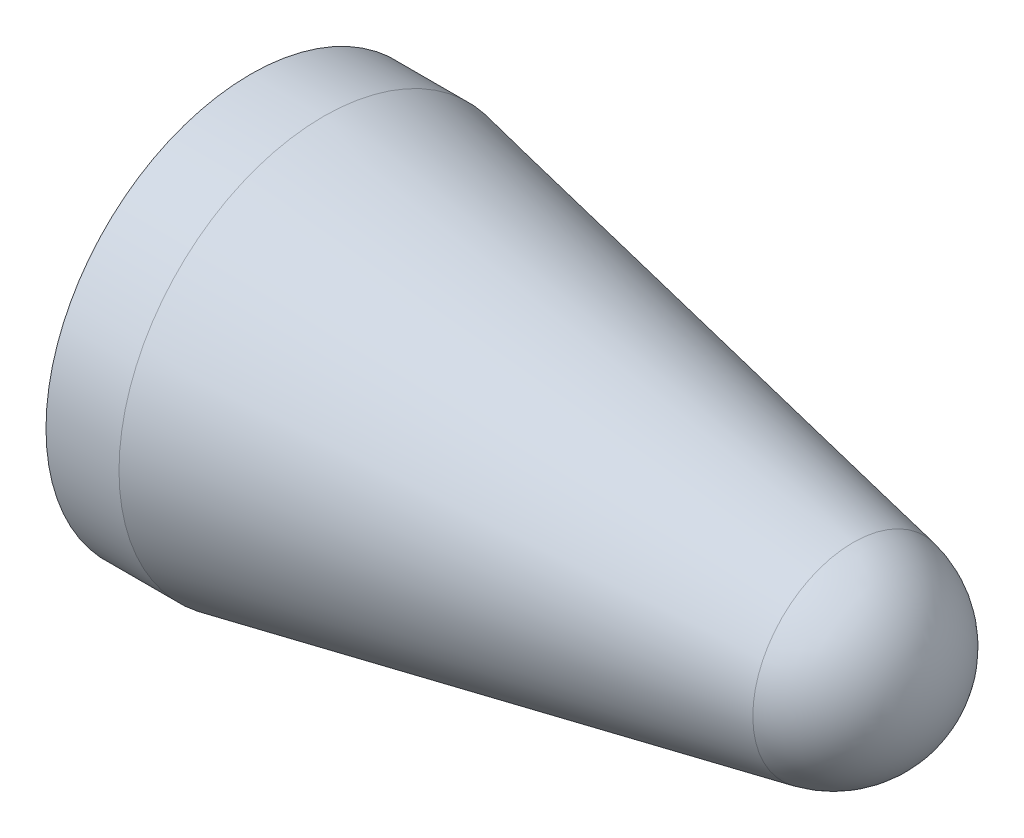
ISO-10303-21;
HEADER;
FILE_DESCRIPTION(('STEP AP214'),'2;1');
FILE_NAME('part.step','',(''),(''),'','','');
FILE_SCHEMA(('AUTOMOTIVE_DESIGN { 1 0 10303 214 1 1 1 1 }'));
ENDSEC;
DATA;
#1=APPLICATION_CONTEXT('core data for automotive mechanical design processes');
#2=APPLICATION_PROTOCOL_DEFINITION('international standard','automotive_design',2000,#1);
#3=PRODUCT_CONTEXT('',#1,'mechanical');
#4=PRODUCT('Part','Part','',(#3));
#5=PRODUCT_RELATED_PRODUCT_CATEGORY('part','',(#4));
#6=PRODUCT_DEFINITION_FORMATION('','',#4);
#7=PRODUCT_DEFINITION_CONTEXT('part definition',#1,'design');
#8=PRODUCT_DEFINITION('design','',#6,#7);
#9=PRODUCT_DEFINITION_SHAPE('','',#8);
#10=(LENGTH_UNIT() NAMED_UNIT(*) SI_UNIT(.MILLI.,.METRE.));
#11=(NAMED_UNIT(*) PLANE_ANGLE_UNIT() SI_UNIT($,.RADIAN.));
#12=(NAMED_UNIT(*) SI_UNIT($,.STERADIAN.) SOLID_ANGLE_UNIT());
#13=UNCERTAINTY_MEASURE_WITH_UNIT(LENGTH_MEASURE(1.E-05),#10,'distance_accuracy_value','');
#14=(GEOMETRIC_REPRESENTATION_CONTEXT(3) GLOBAL_UNCERTAINTY_ASSIGNED_CONTEXT((#13)) GLOBAL_UNIT_ASSIGNED_CONTEXT((#10,
#11,#12)) REPRESENTATION_CONTEXT('',''));
#15=CARTESIAN_POINT('',(0.,0.,0.));
#16=DIRECTION('',(0.,0.,1.));
#17=DIRECTION('',(1.,0.,0.));
#18=AXIS2_PLACEMENT_3D('',#15,#16,#17);
#19=CARTESIAN_POINT('',(33.,0.,0.));
#20=DIRECTION('',(-1.,0.,0.));
#21=DIRECTION('',(0.,1.,0.));
#22=AXIS2_PLACEMENT_3D('',#19,#20,#21);
#23=SPHERICAL_SURFACE('',#22,10.);
#24=CARTESIAN_POINT('',(34.9301554525818,0.,0.));
#25=DIRECTION('',(-1.,0.,0.));
#26=DIRECTION('',(0.,0.,1.));
#27=AXIS2_PLACEMENT_3D('',#24,#25,#26);
#28=CIRCLE('',#27,9.81195698772008);
#29=CARTESIAN_POINT('',(34.9301554525818,0.,9.81195698772008));
#30=VERTEX_POINT('',#29);
#31=EDGE_CURVE('E10',#30,#30,#28,.T.);
#32=ORIENTED_EDGE('',*,*,#31,.F.);
#33=EDGE_LOOP('',(#32));
#34=FACE_BOUND('',#33,.T.);
#35=ADVANCED_FACE('F37',(#34),#23,.T.);
#36=CARTESIAN_POINT('',(34.9301554525818,0.,0.));
#37=DIRECTION('',(-1.,0.,0.));
#38=DIRECTION('',(0.,0.,1.));
#39=AXIS2_PLACEMENT_3D('',#36,#37,#38);
#40=CONICAL_SURFACE('',#39,9.81195698772008,0.194234560116544);
#41=CARTESIAN_POINT('',(-16.8608231920769,0.,0.));
#42=DIRECTION('',(-1.,0.,0.));
#43=DIRECTION('',(0.,0.,1.));
#44=AXIS2_PLACEMENT_3D('',#41,#42,#43);
#45=CIRCLE('',#44,20.);
#46=CARTESIAN_POINT('',(-16.8608231920769,0.,20.));
#47=VERTEX_POINT('',#46);
#48=EDGE_CURVE('E43',#47,#47,#45,.T.);
#49=ORIENTED_EDGE('',*,*,#48,.F.);
#50=EDGE_LOOP('',(#49));
#51=FACE_BOUND('',#50,.T.);
#52=ORIENTED_EDGE('',*,*,#31,.T.);
#53=EDGE_LOOP('',(#52));
#54=FACE_BOUND('',#53,.T.);
#55=ADVANCED_FACE('F85',(#51,#54),#40,.T.);
#56=CARTESIAN_POINT('',(39.,0.,0.));
#57=DIRECTION('',(-1.,0.,0.));
#58=DIRECTION('',(0.,0.,1.));
#59=AXIS2_PLACEMENT_3D('',#56,#57,#58);
#60=CYLINDRICAL_SURFACE('',#59,20.);
#61=CARTESIAN_POINT('',(-24.,0.,0.));
#62=DIRECTION('',(-1.,0.,0.));
#63=DIRECTION('',(0.,0.,1.));
#64=AXIS2_PLACEMENT_3D('',#61,#62,#63);
#65=CIRCLE('',#64,20.);
#66=CARTESIAN_POINT('',(-24.,0.,20.));
#67=VERTEX_POINT('',#66);
#68=EDGE_CURVE('E47',#67,#67,#65,.T.);
#69=ORIENTED_EDGE('',*,*,#68,.F.);
#70=EDGE_LOOP('',(#69));
#71=FACE_BOUND('',#70,.T.);
#72=ORIENTED_EDGE('',*,*,#48,.T.);
#73=EDGE_LOOP('',(#72));
#74=FACE_BOUND('',#73,.T.);
#75=ADVANCED_FACE('F80',(#71,#74),#60,.T.);
#76=CARTESIAN_POINT('',(-24.,16.,0.));
#77=DIRECTION('',(1.,0.,0.));
#78=DIRECTION('',(0.,0.,-1.));
#79=AXIS2_PLACEMENT_3D('',#76,#77,#78);
#80=PLANE('',#79);
#81=CARTESIAN_POINT('',(-24.,0.,0.));
#82=DIRECTION('',(-1.,0.,0.));
#83=DIRECTION('',(0.,0.,1.));
#84=AXIS2_PLACEMENT_3D('',#81,#82,#83);
#85=CIRCLE('',#84,16.);
#86=CARTESIAN_POINT('',(-24.,0.,16.));
#87=VERTEX_POINT('',#86);
#88=EDGE_CURVE('E51',#87,#87,#85,.T.);
#89=ORIENTED_EDGE('',*,*,#88,.F.);
#90=EDGE_LOOP('',(#89));
#91=FACE_BOUND('',#90,.T.);
#92=ORIENTED_EDGE('',*,*,#68,.T.);
#93=EDGE_LOOP('',(#92));
#94=FACE_BOUND('',#93,.T.);
#95=ADVANCED_FACE('F74',(#91,#94),#80,.F.);
#96=CARTESIAN_POINT('',(39.,0.,0.));
#97=DIRECTION('',(-1.,0.,0.));
#98=DIRECTION('',(0.,0.,1.));
#99=AXIS2_PLACEMENT_3D('',#96,#97,#98);
#100=CYLINDRICAL_SURFACE('',#99,16.);
#101=CARTESIAN_POINT('',(-17.2505182542615,0.,0.));
#102=DIRECTION('',(-1.,0.,0.));
#103=DIRECTION('',(0.,0.,1.));
#104=AXIS2_PLACEMENT_3D('',#101,#102,#103);
#105=CIRCLE('',#104,16.);
#106=CARTESIAN_POINT('',(-17.2505182542615,0.,16.));
#107=VERTEX_POINT('',#106);
#108=EDGE_CURVE('E56',#107,#107,#105,.T.);
#109=ORIENTED_EDGE('',*,*,#108,.F.);
#110=EDGE_LOOP('',(#109));
#111=FACE_BOUND('',#110,.T.);
#112=ORIENTED_EDGE('',*,*,#88,.T.);
#113=EDGE_LOOP('',(#112));
#114=FACE_BOUND('',#113,.T.);
#115=ADVANCED_FACE('F68',(#111,#114),#100,.F.);
#116=CARTESIAN_POINT('',(-2.,0.,0.));
#117=DIRECTION('',(-1.,0.,0.));
#118=DIRECTION('',(0.,0.,1.));
#119=AXIS2_PLACEMENT_3D('',#116,#117,#118);
#120=CONICAL_SURFACE('',#119,13.,0.194234560116544);
#121=CARTESIAN_POINT('',(34.158093271549,0.,0.));
#122=DIRECTION('',(-1.,0.,0.));
#123=DIRECTION('',(0.,0.,1.));
#124=AXIS2_PLACEMENT_3D('',#121,#122,#123);
#125=CIRCLE('',#124,5.88717419263205);
#126=CARTESIAN_POINT('',(34.158093271549,0.,5.88717419263205));
#127=VERTEX_POINT('',#126);
#128=EDGE_CURVE('E59',#127,#127,#125,.T.);
#129=ORIENTED_EDGE('',*,*,#128,.F.);
#130=EDGE_LOOP('',(#129));
#131=FACE_BOUND('',#130,.T.);
#132=ORIENTED_EDGE('',*,*,#108,.T.);
#133=EDGE_LOOP('',(#132));
#134=FACE_BOUND('',#133,.T.);
#135=ADVANCED_FACE('F65',(#131,#134),#120,.F.);
#136=CARTESIAN_POINT('',(33.,0.,0.));
#137=DIRECTION('',(-1.,0.,0.));
#138=DIRECTION('',(0.,1.,0.));
#139=AXIS2_PLACEMENT_3D('',#136,#137,#138);
#140=SPHERICAL_SURFACE('',#139,6.);
#141=ORIENTED_EDGE('',*,*,#128,.T.);
#142=EDGE_LOOP('',(#141));
#143=FACE_BOUND('',#142,.T.);
#144=ADVANCED_FACE('F63',(#143),#140,.F.);
#145=CLOSED_SHELL('',(#35,#55,#75,#95,#115,#135,#144));
#146=MANIFOLD_SOLID_BREP('B2',#145);
#147=ADVANCED_BREP_SHAPE_REPRESENTATION('',(#18,#146),#14);
#148=SHAPE_DEFINITION_REPRESENTATION(#9,#147);
ENDSEC;
END-ISO-10303-21;
